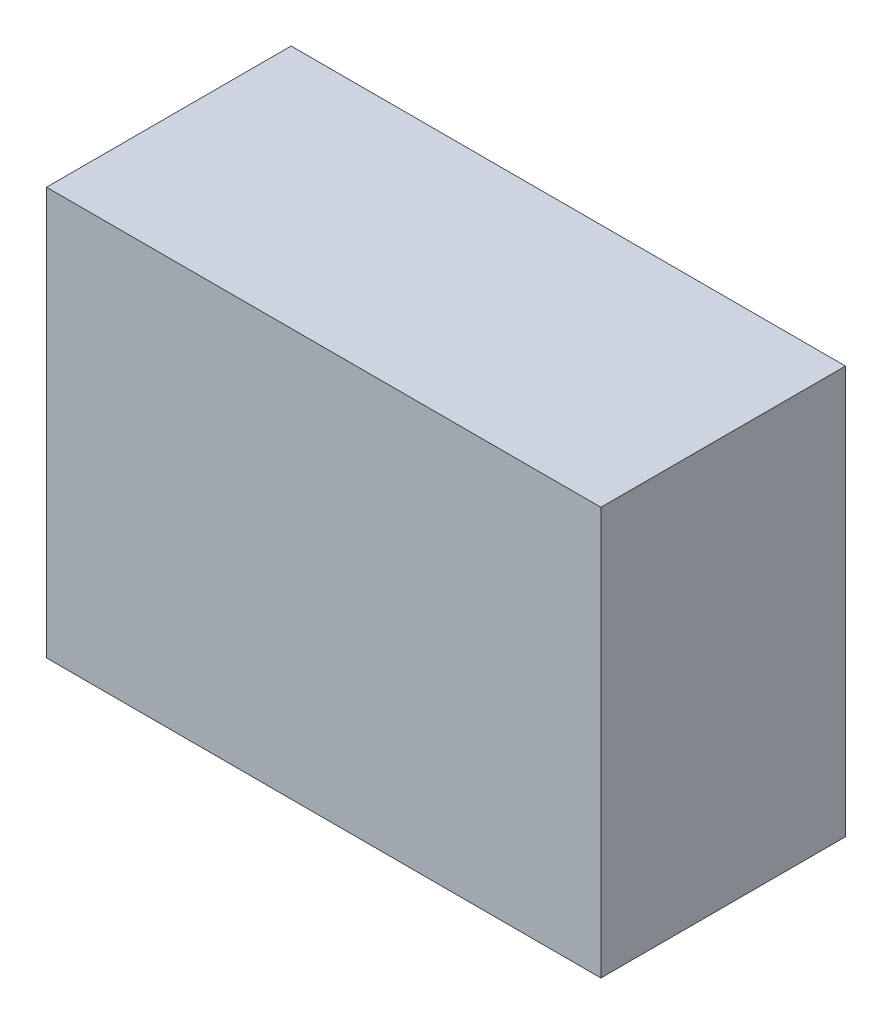
ISO-10303-21;
HEADER;
FILE_DESCRIPTION(('STEP AP214'),'2;1');
FILE_NAME('part.step','',(''),(''),'','','');
FILE_SCHEMA(('AUTOMOTIVE_DESIGN { 1 0 10303 214 1 1 1 1 }'));
ENDSEC;
DATA;
#1=APPLICATION_CONTEXT('core data for automotive mechanical design processes');
#2=APPLICATION_PROTOCOL_DEFINITION('international standard','automotive_design',2000,#1);
#3=PRODUCT_CONTEXT('',#1,'mechanical');
#4=PRODUCT('Part','Part','',(#3));
#5=PRODUCT_RELATED_PRODUCT_CATEGORY('part','',(#4));
#6=PRODUCT_DEFINITION_FORMATION('','',#4);
#7=PRODUCT_DEFINITION_CONTEXT('part definition',#1,'design');
#8=PRODUCT_DEFINITION('design','',#6,#7);
#9=PRODUCT_DEFINITION_SHAPE('','',#8);
#10=(LENGTH_UNIT() NAMED_UNIT(*) SI_UNIT(.MILLI.,.METRE.));
#11=(NAMED_UNIT(*) PLANE_ANGLE_UNIT() SI_UNIT($,.RADIAN.));
#12=(NAMED_UNIT(*) SI_UNIT($,.STERADIAN.) SOLID_ANGLE_UNIT());
#13=UNCERTAINTY_MEASURE_WITH_UNIT(LENGTH_MEASURE(1.E-05),#10,'distance_accuracy_value','');
#14=(GEOMETRIC_REPRESENTATION_CONTEXT(3) GLOBAL_UNCERTAINTY_ASSIGNED_CONTEXT((#13)) GLOBAL_UNIT_ASSIGNED_CONTEXT((#10,
#11,#12)) REPRESENTATION_CONTEXT('',''));
#15=CARTESIAN_POINT('',(0.,0.,0.));
#16=DIRECTION('',(0.,0.,1.));
#17=DIRECTION('',(1.,0.,0.));
#18=AXIS2_PLACEMENT_3D('',#15,#16,#17);
#19=CARTESIAN_POINT('',(-86.36,-63.5,76.2));
#20=DIRECTION('',(1.,0.,0.));
#21=DIRECTION('',(0.,0.,-1.));
#22=AXIS2_PLACEMENT_3D('',#19,#20,#21);
#23=PLANE('',#22);
#24=DIRECTION('',(0.,-1.,0.));
#25=VECTOR('',#24,1.);
#26=CARTESIAN_POINT('',(-86.36,-63.5,0.));
#27=LINE('',#26,#25);
#28=CARTESIAN_POINT('',(-86.36,63.5,0.));
#29=VERTEX_POINT('',#28);
#30=CARTESIAN_POINT('',(-86.36,-63.5,0.));
#31=VERTEX_POINT('',#30);
#32=EDGE_CURVE('E107',#29,#31,#27,.T.);
#33=ORIENTED_EDGE('',*,*,#32,.T.);
#34=DIRECTION('',(0.,0.,-1.));
#35=VECTOR('',#34,1.);
#36=CARTESIAN_POINT('',(-86.36,-63.5,76.2));
#37=LINE('',#36,#35);
#38=CARTESIAN_POINT('',(-86.36,-63.5,76.2));
#39=VERTEX_POINT('',#38);
#40=EDGE_CURVE('E11',#39,#31,#37,.T.);
#41=ORIENTED_EDGE('',*,*,#40,.F.);
#42=DIRECTION('',(0.,-1.,0.));
#43=VECTOR('',#42,1.);
#44=CARTESIAN_POINT('',(-86.36,-63.5,76.2));
#45=LINE('',#44,#43);
#46=CARTESIAN_POINT('',(-86.36,63.5,76.2));
#47=VERTEX_POINT('',#46);
#48=EDGE_CURVE('E91',#47,#39,#45,.T.);
#49=ORIENTED_EDGE('',*,*,#48,.F.);
#50=DIRECTION('',(0.,0.,-1.));
#51=VECTOR('',#50,1.);
#52=CARTESIAN_POINT('',(-86.36,63.5,76.2));
#53=LINE('',#52,#51);
#54=EDGE_CURVE('E103',#47,#29,#53,.T.);
#55=ORIENTED_EDGE('',*,*,#54,.T.);
#56=EDGE_LOOP('',(#33,#41,#49,#55));
#57=FACE_BOUND('',#56,.T.);
#58=ADVANCED_FACE('F39',(#57),#23,.F.);
#59=CARTESIAN_POINT('',(86.36,-63.5,76.2));
#60=DIRECTION('',(0.,1.,0.));
#61=DIRECTION('',(-1.,0.,0.));
#62=AXIS2_PLACEMENT_3D('',#59,#60,#61);
#63=PLANE('',#62);
#64=DIRECTION('',(1.,0.,0.));
#65=VECTOR('',#64,1.);
#66=CARTESIAN_POINT('',(86.36,-63.5,0.));
#67=LINE('',#66,#65);
#68=CARTESIAN_POINT('',(86.36,-63.5,0.));
#69=VERTEX_POINT('',#68);
#70=EDGE_CURVE('E96',#31,#69,#67,.T.);
#71=ORIENTED_EDGE('',*,*,#70,.T.);
#72=DIRECTION('',(0.,0.,-1.));
#73=VECTOR('',#72,1.);
#74=CARTESIAN_POINT('',(86.36,-63.5,76.2));
#75=LINE('',#74,#73);
#76=CARTESIAN_POINT('',(86.36,-63.5,76.2));
#77=VERTEX_POINT('',#76);
#78=EDGE_CURVE('E48',#77,#69,#75,.T.);
#79=ORIENTED_EDGE('',*,*,#78,.F.);
#80=DIRECTION('',(1.,0.,0.));
#81=VECTOR('',#80,1.);
#82=CARTESIAN_POINT('',(86.36,-63.5,76.2));
#83=LINE('',#82,#81);
#84=EDGE_CURVE('E86',#39,#77,#83,.T.);
#85=ORIENTED_EDGE('',*,*,#84,.F.);
#86=ORIENTED_EDGE('',*,*,#40,.T.);
#87=EDGE_LOOP('',(#71,#79,#85,#86));
#88=FACE_BOUND('',#87,.T.);
#89=ADVANCED_FACE('F95',(#88),#63,.F.);
#90=CARTESIAN_POINT('',(86.36,-63.5,76.2));
#91=DIRECTION('',(-1.,0.,0.));
#92=DIRECTION('',(0.,0.,1.));
#93=AXIS2_PLACEMENT_3D('',#90,#91,#92);
#94=PLANE('',#93);
#95=DIRECTION('',(0.,1.,0.));
#96=VECTOR('',#95,1.);
#97=CARTESIAN_POINT('',(86.36,-63.5,0.));
#98=LINE('',#97,#96);
#99=CARTESIAN_POINT('',(86.36,63.5,0.));
#100=VERTEX_POINT('',#99);
#101=EDGE_CURVE('E73',#69,#100,#98,.T.);
#102=ORIENTED_EDGE('',*,*,#101,.T.);
#103=DIRECTION('',(0.,0.,-1.));
#104=VECTOR('',#103,1.);
#105=CARTESIAN_POINT('',(86.36,63.5,76.2));
#106=LINE('',#105,#104);
#107=CARTESIAN_POINT('',(86.36,63.5,76.2));
#108=VERTEX_POINT('',#107);
#109=EDGE_CURVE('E98',#108,#100,#106,.T.);
#110=ORIENTED_EDGE('',*,*,#109,.F.);
#111=DIRECTION('',(0.,1.,0.));
#112=VECTOR('',#111,1.);
#113=CARTESIAN_POINT('',(86.36,-63.5,76.2));
#114=LINE('',#113,#112);
#115=EDGE_CURVE('E89',#77,#108,#114,.T.);
#116=ORIENTED_EDGE('',*,*,#115,.F.);
#117=ORIENTED_EDGE('',*,*,#78,.T.);
#118=EDGE_LOOP('',(#102,#110,#116,#117));
#119=FACE_BOUND('',#118,.T.);
#120=ADVANCED_FACE('F99',(#119),#94,.F.);
#121=CARTESIAN_POINT('',(86.36,63.5,76.2));
#122=DIRECTION('',(0.,-1.,0.));
#123=DIRECTION('',(1.,0.,0.));
#124=AXIS2_PLACEMENT_3D('',#121,#122,#123);
#125=PLANE('',#124);
#126=DIRECTION('',(-1.,0.,0.));
#127=VECTOR('',#126,1.);
#128=CARTESIAN_POINT('',(86.36,63.5,0.));
#129=LINE('',#128,#127);
#130=EDGE_CURVE('E79',#100,#29,#129,.T.);
#131=ORIENTED_EDGE('',*,*,#130,.T.);
#132=ORIENTED_EDGE('',*,*,#54,.F.);
#133=DIRECTION('',(-1.,0.,0.));
#134=VECTOR('',#133,1.);
#135=CARTESIAN_POINT('',(86.36,63.5,76.2));
#136=LINE('',#135,#134);
#137=EDGE_CURVE('E56',#108,#47,#136,.T.);
#138=ORIENTED_EDGE('',*,*,#137,.F.);
#139=ORIENTED_EDGE('',*,*,#109,.T.);
#140=EDGE_LOOP('',(#131,#132,#138,#139));
#141=FACE_BOUND('',#140,.T.);
#142=ADVANCED_FACE('F120',(#141),#125,.F.);
#143=CARTESIAN_POINT('',(0.,0.,76.2));
#144=DIRECTION('',(0.,0.,1.));
#145=DIRECTION('',(1.,0.,0.));
#146=AXIS2_PLACEMENT_3D('',#143,#144,#145);
#147=PLANE('',#146);
#148=ORIENTED_EDGE('',*,*,#48,.T.);
#149=ORIENTED_EDGE('',*,*,#84,.T.);
#150=ORIENTED_EDGE('',*,*,#115,.T.);
#151=ORIENTED_EDGE('',*,*,#137,.T.);
#152=EDGE_LOOP('',(#148,#149,#150,#151));
#153=FACE_BOUND('',#152,.T.);
#154=ADVANCED_FACE('F87',(#153),#147,.T.);
#155=CARTESIAN_POINT('',(0.,0.,0.));
#156=DIRECTION('',(0.,0.,1.));
#157=DIRECTION('',(1.,0.,0.));
#158=AXIS2_PLACEMENT_3D('',#155,#156,#157);
#159=PLANE('',#158);
#160=ORIENTED_EDGE('',*,*,#32,.F.);
#161=ORIENTED_EDGE('',*,*,#130,.F.);
#162=ORIENTED_EDGE('',*,*,#101,.F.);
#163=ORIENTED_EDGE('',*,*,#70,.F.);
#164=EDGE_LOOP('',(#160,#161,#162,#163));
#165=FACE_BOUND('',#164,.T.);
#166=ADVANCED_FACE('F123',(#165),#159,.F.);
#167=CLOSED_SHELL('',(#58,#89,#120,#142,#154,#166));
#168=MANIFOLD_SOLID_BREP('B2',#167);
#169=ADVANCED_BREP_SHAPE_REPRESENTATION('',(#18,#168),#14);
#170=SHAPE_DEFINITION_REPRESENTATION(#9,#169);
ENDSEC;
END-ISO-10303-21;
